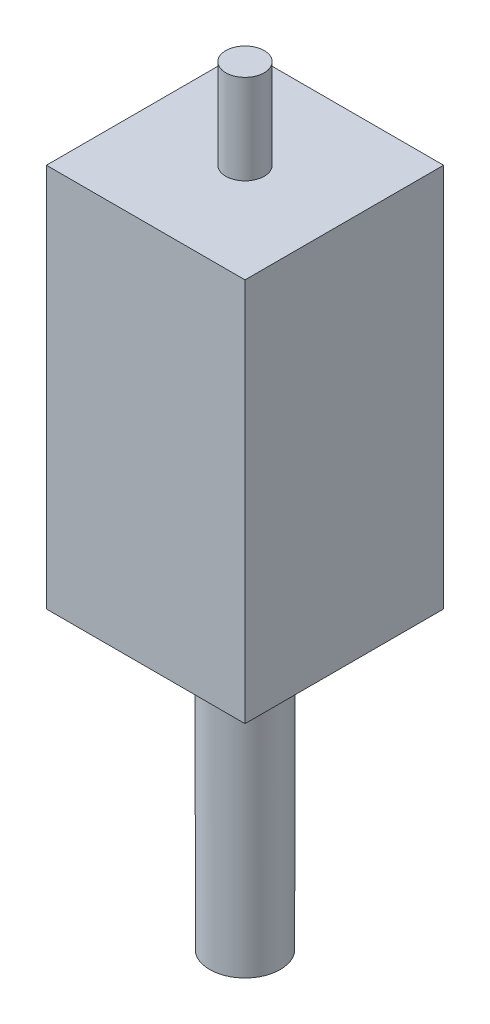
ISO-10303-21;
HEADER;
FILE_DESCRIPTION(('STEP AP214'),'2;1');
FILE_NAME('part.step','',(''),(''),'','','');
FILE_SCHEMA(('AUTOMOTIVE_DESIGN { 1 0 10303 214 1 1 1 1 }'));
ENDSEC;
DATA;
#1=APPLICATION_CONTEXT('core data for automotive mechanical design processes');
#2=APPLICATION_PROTOCOL_DEFINITION('international standard','automotive_design',2000,#1);
#3=PRODUCT_CONTEXT('',#1,'mechanical');
#4=PRODUCT('Part','Part','',(#3));
#5=PRODUCT_RELATED_PRODUCT_CATEGORY('part','',(#4));
#6=PRODUCT_DEFINITION_FORMATION('','',#4);
#7=PRODUCT_DEFINITION_CONTEXT('part definition',#1,'design');
#8=PRODUCT_DEFINITION('design','',#6,#7);
#9=PRODUCT_DEFINITION_SHAPE('','',#8);
#10=(LENGTH_UNIT() NAMED_UNIT(*) SI_UNIT(.MILLI.,.METRE.));
#11=(NAMED_UNIT(*) PLANE_ANGLE_UNIT() SI_UNIT($,.RADIAN.));
#12=(NAMED_UNIT(*) SI_UNIT($,.STERADIAN.) SOLID_ANGLE_UNIT());
#13=UNCERTAINTY_MEASURE_WITH_UNIT(LENGTH_MEASURE(1.E-05),#10,'distance_accuracy_value','');
#14=(GEOMETRIC_REPRESENTATION_CONTEXT(3) GLOBAL_UNCERTAINTY_ASSIGNED_CONTEXT((#13)) GLOBAL_UNIT_ASSIGNED_CONTEXT((#10,
#11,#12)) REPRESENTATION_CONTEXT('',''));
#15=CARTESIAN_POINT('',(0.,0.,0.));
#16=DIRECTION('',(0.,0.,1.));
#17=DIRECTION('',(1.,0.,0.));
#18=AXIS2_PLACEMENT_3D('',#15,#16,#17);
#19=CARTESIAN_POINT('',(-0.879709692178446,15.8049516041819,15.5));
#20=DIRECTION('',(1.,0.,0.));
#21=DIRECTION('',(0.,1.,0.));
#22=AXIS2_PLACEMENT_3D('',#19,#20,#21);
#23=PLANE('',#22);
#24=CARTESIAN_POINT('',(-0.879709692178446,8.30495160418194,7.75));
#25=DIRECTION('',(-1.,0.,0.));
#26=DIRECTION('',(0.,0.,1.));
#27=AXIS2_PLACEMENT_3D('',#24,#25,#26);
#28=CIRCLE('',#27,1.24999999999999);
#29=CARTESIAN_POINT('',(-0.879709692178446,8.30495160418194,8.99999999999999));
#30=VERTEX_POINT('',#29);
#31=EDGE_CURVE('E99',#30,#30,#28,.T.);
#32=ORIENTED_EDGE('',*,*,#31,.F.);
#33=EDGE_LOOP('',(#32));
#34=FACE_BOUND('',#33,.T.);
#35=CARTESIAN_POINT('',(-0.879709692178445,-6.69504839581806,7.75));
#36=DIRECTION('',(-1.,0.,0.));
#37=DIRECTION('',(0.,0.,1.));
#38=AXIS2_PLACEMENT_3D('',#35,#36,#37);
#39=CIRCLE('',#38,1.24999999999999);
#40=CARTESIAN_POINT('',(-0.879709692178445,-6.69504839581806,8.99999999999999));
#41=VERTEX_POINT('',#40);
#42=EDGE_CURVE('E98',#41,#41,#39,.T.);
#43=ORIENTED_EDGE('',*,*,#42,.F.);
#44=EDGE_LOOP('',(#43));
#45=FACE_BOUND('',#44,.T.);
#46=DIRECTION('',(0.,-1.,0.));
#47=VECTOR('',#46,1.);
#48=CARTESIAN_POINT('',(-0.879709692178446,15.8049516041819,0.));
#49=LINE('',#48,#47);
#50=CARTESIAN_POINT('',(-0.879709692178446,15.8049516041819,0.));
#51=VERTEX_POINT('',#50);
#52=CARTESIAN_POINT('',(-0.879709692178442,-14.1950483958181,0.));
#53=VERTEX_POINT('',#52);
#54=EDGE_CURVE('E115',#51,#53,#49,.T.);
#55=ORIENTED_EDGE('',*,*,#54,.T.);
#56=DIRECTION('',(0.,0.,-1.));
#57=VECTOR('',#56,1.);
#58=CARTESIAN_POINT('',(-0.879709692178442,-14.1950483958181,15.5));
#59=LINE('',#58,#57);
#60=CARTESIAN_POINT('',(-0.879709692178442,-14.1950483958181,15.5));
#61=VERTEX_POINT('',#60);
#62=EDGE_CURVE('E134',#61,#53,#59,.T.);
#63=ORIENTED_EDGE('',*,*,#62,.F.);
#64=DIRECTION('',(0.,-1.,0.));
#65=VECTOR('',#64,1.);
#66=CARTESIAN_POINT('',(-0.879709692178446,15.8049516041819,15.5));
#67=LINE('',#66,#65);
#68=CARTESIAN_POINT('',(-0.879709692178446,15.8049516041819,15.5));
#69=VERTEX_POINT('',#68);
#70=EDGE_CURVE('E116',#69,#61,#67,.T.);
#71=ORIENTED_EDGE('',*,*,#70,.F.);
#72=DIRECTION('',(0.,0.,-1.));
#73=VECTOR('',#72,1.);
#74=CARTESIAN_POINT('',(-0.879709692178446,15.8049516041819,15.5));
#75=LINE('',#74,#73);
#76=EDGE_CURVE('E122',#69,#51,#75,.T.);
#77=ORIENTED_EDGE('',*,*,#76,.T.);
#78=EDGE_LOOP('',(#55,#63,#71,#77));
#79=FACE_BOUND('',#78,.T.);
#80=ADVANCED_FACE('F33',(#34,#45,#79),#23,.F.);
#81=CARTESIAN_POINT('',(-0.879709692178442,-14.1950483958181,15.5));
#82=DIRECTION('',(0.,1.,0.));
#83=DIRECTION('',(-1.,0.,0.));
#84=AXIS2_PLACEMENT_3D('',#81,#82,#83);
#85=PLANE('',#84);
#86=CARTESIAN_POINT('',(6.87029030782155,-14.1950483958181,7.75));
#87=DIRECTION('',(0.,1.,0.));
#88=DIRECTION('',(-1.,0.,0.));
#89=AXIS2_PLACEMENT_3D('',#86,#87,#88);
#90=CIRCLE('',#89,2.75);
#91=CARTESIAN_POINT('',(4.12029030782155,-14.1950483958181,7.75));
#92=VERTEX_POINT('',#91);
#93=EDGE_CURVE('E11',#92,#92,#90,.F.);
#94=ORIENTED_EDGE('',*,*,#93,.F.);
#95=EDGE_LOOP('',(#94));
#96=FACE_BOUND('',#95,.T.);
#97=DIRECTION('',(1.,0.,0.));
#98=VECTOR('',#97,1.);
#99=CARTESIAN_POINT('',(-0.879709692178442,-14.1950483958181,0.));
#100=LINE('',#99,#98);
#101=CARTESIAN_POINT('',(14.6202903078216,-14.1950483958181,0.));
#102=VERTEX_POINT('',#101);
#103=EDGE_CURVE('E125',#53,#102,#100,.T.);
#104=ORIENTED_EDGE('',*,*,#103,.T.);
#105=DIRECTION('',(0.,0.,-1.));
#106=VECTOR('',#105,1.);
#107=CARTESIAN_POINT('',(14.6202903078216,-14.1950483958181,15.5));
#108=LINE('',#107,#106);
#109=CARTESIAN_POINT('',(14.6202903078216,-14.1950483958181,15.5));
#110=VERTEX_POINT('',#109);
#111=EDGE_CURVE('E132',#110,#102,#108,.T.);
#112=ORIENTED_EDGE('',*,*,#111,.F.);
#113=DIRECTION('',(1.,0.,0.));
#114=VECTOR('',#113,1.);
#115=CARTESIAN_POINT('',(-0.879709692178442,-14.1950483958181,15.5));
#116=LINE('',#115,#114);
#117=EDGE_CURVE('E81',#61,#110,#116,.T.);
#118=ORIENTED_EDGE('',*,*,#117,.F.);
#119=ORIENTED_EDGE('',*,*,#62,.T.);
#120=EDGE_LOOP('',(#104,#112,#118,#119));
#121=FACE_BOUND('',#120,.T.);
#122=ADVANCED_FACE('F151',(#96,#121),#85,.F.);
#123=CARTESIAN_POINT('',(14.6202903078216,15.8049516041819,15.5));
#124=DIRECTION('',(-1.,0.,0.));
#125=DIRECTION('',(0.,0.,1.));
#126=AXIS2_PLACEMENT_3D('',#123,#124,#125);
#127=PLANE('',#126);
#128=DIRECTION('',(0.,1.,0.));
#129=VECTOR('',#128,1.);
#130=CARTESIAN_POINT('',(14.6202903078216,15.8049516041819,0.));
#131=LINE('',#130,#129);
#132=CARTESIAN_POINT('',(14.6202903078216,15.8049516041819,0.));
#133=VERTEX_POINT('',#132);
#134=EDGE_CURVE('E67',#102,#133,#131,.T.);
#135=ORIENTED_EDGE('',*,*,#134,.T.);
#136=DIRECTION('',(0.,0.,-1.));
#137=VECTOR('',#136,1.);
#138=CARTESIAN_POINT('',(14.6202903078216,15.8049516041819,15.5));
#139=LINE('',#138,#137);
#140=CARTESIAN_POINT('',(14.6202903078216,15.8049516041819,15.5));
#141=VERTEX_POINT('',#140);
#142=EDGE_CURVE('E130',#141,#133,#139,.T.);
#143=ORIENTED_EDGE('',*,*,#142,.F.);
#144=DIRECTION('',(0.,1.,0.));
#145=VECTOR('',#144,1.);
#146=CARTESIAN_POINT('',(14.6202903078216,15.8049516041819,15.5));
#147=LINE('',#146,#145);
#148=EDGE_CURVE('E119',#110,#141,#147,.T.);
#149=ORIENTED_EDGE('',*,*,#148,.F.);
#150=ORIENTED_EDGE('',*,*,#111,.T.);
#151=EDGE_LOOP('',(#135,#143,#149,#150));
#152=FACE_BOUND('',#151,.T.);
#153=ADVANCED_FACE('F143',(#152),#127,.F.);
#154=CARTESIAN_POINT('',(-0.879709692178446,15.8049516041819,15.5));
#155=DIRECTION('',(0.,-1.,0.));
#156=DIRECTION('',(0.,0.,-1.));
#157=AXIS2_PLACEMENT_3D('',#154,#155,#156);
#158=PLANE('',#157);
#159=CARTESIAN_POINT('',(6.87029030782155,15.8049516041819,7.75));
#160=DIRECTION('',(0.,-1.,0.));
#161=DIRECTION('',(0.,0.,-1.));
#162=AXIS2_PLACEMENT_3D('',#159,#160,#161);
#163=CIRCLE('',#162,1.5);
#164=CARTESIAN_POINT('',(6.87029030782155,15.8049516041819,6.25));
#165=VERTEX_POINT('',#164);
#166=EDGE_CURVE('E41',#165,#165,#163,.F.);
#167=ORIENTED_EDGE('',*,*,#166,.F.);
#168=EDGE_LOOP('',(#167));
#169=FACE_BOUND('',#168,.T.);
#170=DIRECTION('',(-1.,0.,0.));
#171=VECTOR('',#170,1.);
#172=CARTESIAN_POINT('',(-0.879709692178446,15.8049516041819,0.));
#173=LINE('',#172,#171);
#174=EDGE_CURVE('E73',#133,#51,#173,.T.);
#175=ORIENTED_EDGE('',*,*,#174,.T.);
#176=ORIENTED_EDGE('',*,*,#76,.F.);
#177=DIRECTION('',(-1.,0.,0.));
#178=VECTOR('',#177,1.);
#179=CARTESIAN_POINT('',(-0.879709692178446,15.8049516041819,15.5));
#180=LINE('',#179,#178);
#181=EDGE_CURVE('E49',#141,#69,#180,.T.);
#182=ORIENTED_EDGE('',*,*,#181,.F.);
#183=ORIENTED_EDGE('',*,*,#142,.T.);
#184=EDGE_LOOP('',(#175,#176,#182,#183));
#185=FACE_BOUND('',#184,.T.);
#186=ADVANCED_FACE('F140',(#169,#185),#158,.F.);
#187=CARTESIAN_POINT('',(0.,0.,15.5));
#188=DIRECTION('',(0.,0.,1.));
#189=DIRECTION('',(1.,0.,0.));
#190=AXIS2_PLACEMENT_3D('',#187,#188,#189);
#191=PLANE('',#190);
#192=ORIENTED_EDGE('',*,*,#70,.T.);
#193=ORIENTED_EDGE('',*,*,#117,.T.);
#194=ORIENTED_EDGE('',*,*,#148,.T.);
#195=ORIENTED_EDGE('',*,*,#181,.T.);
#196=EDGE_LOOP('',(#192,#193,#194,#195));
#197=FACE_BOUND('',#196,.T.);
#198=ADVANCED_FACE('F142',(#197),#191,.T.);
#199=CARTESIAN_POINT('',(0.,0.,0.));
#200=DIRECTION('',(0.,0.,1.));
#201=DIRECTION('',(1.,0.,0.));
#202=AXIS2_PLACEMENT_3D('',#199,#200,#201);
#203=PLANE('',#202);
#204=ORIENTED_EDGE('',*,*,#54,.F.);
#205=ORIENTED_EDGE('',*,*,#174,.F.);
#206=ORIENTED_EDGE('',*,*,#134,.F.);
#207=ORIENTED_EDGE('',*,*,#103,.F.);
#208=EDGE_LOOP('',(#204,#205,#206,#207));
#209=FACE_BOUND('',#208,.T.);
#210=ADVANCED_FACE('F149',(#209),#203,.F.);
#211=CARTESIAN_POINT('',(6.87029030782155,22.8049516041819,7.75));
#212=DIRECTION('',(0.,-1.,0.));
#213=DIRECTION('',(0.,0.,-1.));
#214=AXIS2_PLACEMENT_3D('',#211,#212,#213);
#215=CYLINDRICAL_SURFACE('',#214,1.5);
#216=CARTESIAN_POINT('',(6.87029030782155,22.8049516041819,7.75));
#217=DIRECTION('',(0.,1.,0.));
#218=DIRECTION('',(0.,0.,1.));
#219=AXIS2_PLACEMENT_3D('',#216,#217,#218);
#220=CIRCLE('',#219,1.5);
#221=CARTESIAN_POINT('',(6.87029030782155,22.8049516041819,9.25));
#222=VERTEX_POINT('',#221);
#223=EDGE_CURVE('E112',#222,#222,#220,.T.);
#224=ORIENTED_EDGE('',*,*,#223,.F.);
#225=EDGE_LOOP('',(#224));
#226=FACE_BOUND('',#225,.T.);
#227=ORIENTED_EDGE('',*,*,#166,.T.);
#228=EDGE_LOOP('',(#227));
#229=FACE_BOUND('',#228,.T.);
#230=ADVANCED_FACE('F138',(#226,#229),#215,.T.);
#231=CARTESIAN_POINT('',(6.87029030782155,22.8049516041819,7.75));
#232=DIRECTION('',(0.,1.,0.));
#233=DIRECTION('',(0.,0.,1.));
#234=AXIS2_PLACEMENT_3D('',#231,#232,#233);
#235=PLANE('',#234);
#236=ORIENTED_EDGE('',*,*,#223,.T.);
#237=EDGE_LOOP('',(#236));
#238=FACE_BOUND('',#237,.T.);
#239=ADVANCED_FACE('F173',(#238),#235,.T.);
#240=CARTESIAN_POINT('',(6.87029030782156,-37.1950483958181,7.75));
#241=DIRECTION('',(0.,1.,0.));
#242=DIRECTION('',(-1.,0.,0.));
#243=AXIS2_PLACEMENT_3D('',#240,#241,#242);
#244=CYLINDRICAL_SURFACE('',#243,2.75);
#245=CARTESIAN_POINT('',(6.87029030782156,-37.1950483958181,7.75));
#246=DIRECTION('',(0.,-1.,0.));
#247=DIRECTION('',(1.,0.,0.));
#248=AXIS2_PLACEMENT_3D('',#245,#246,#247);
#249=CIRCLE('',#248,2.75);
#250=CARTESIAN_POINT('',(9.62029030782156,-37.1950483958181,7.75));
#251=VERTEX_POINT('',#250);
#252=EDGE_CURVE('E109',#251,#251,#249,.T.);
#253=ORIENTED_EDGE('',*,*,#252,.F.);
#254=EDGE_LOOP('',(#253));
#255=FACE_BOUND('',#254,.T.);
#256=ORIENTED_EDGE('',*,*,#93,.T.);
#257=EDGE_LOOP('',(#256));
#258=FACE_BOUND('',#257,.T.);
#259=ADVANCED_FACE('F179',(#255,#258),#244,.T.);
#260=CARTESIAN_POINT('',(6.87029030782156,-37.1950483958181,7.75));
#261=DIRECTION('',(0.,-1.,0.));
#262=DIRECTION('',(1.,0.,0.));
#263=AXIS2_PLACEMENT_3D('',#260,#261,#262);
#264=PLANE('',#263);
#265=ORIENTED_EDGE('',*,*,#252,.T.);
#266=EDGE_LOOP('',(#265));
#267=FACE_BOUND('',#266,.T.);
#268=ADVANCED_FACE('F183',(#267),#264,.T.);
#269=CARTESIAN_POINT('',(0.220290307821557,-6.69504839581806,7.75));
#270=DIRECTION('',(-1.,0.,0.));
#271=DIRECTION('',(0.,0.,1.));
#272=AXIS2_PLACEMENT_3D('',#269,#270,#271);
#273=CONICAL_SURFACE('',#272,1.25,1.02974425867665);
#274=CARTESIAN_POINT('',(0.971366081606008,-6.69504839581806,7.75));
#275=VERTEX_POINT('',#274);
#276=VERTEX_LOOP('',#275);
#277=FACE_BOUND('',#276,.T.);
#278=CARTESIAN_POINT('',(0.220290307821557,-6.69504839581806,7.75));
#279=DIRECTION('',(-1.,0.,0.));
#280=DIRECTION('',(0.,0.,1.));
#281=AXIS2_PLACEMENT_3D('',#278,#279,#280);
#282=CIRCLE('',#281,1.25);
#283=CARTESIAN_POINT('',(0.220290307821557,-6.69504839581806,9.));
#284=VERTEX_POINT('',#283);
#285=EDGE_CURVE('E102',#284,#284,#282,.T.);
#286=ORIENTED_EDGE('',*,*,#285,.T.);
#287=EDGE_LOOP('',(#286));
#288=FACE_BOUND('',#287,.T.);
#289=ADVANCED_FACE('F187',(#277,#288),#273,.F.);
#290=CARTESIAN_POINT('',(-0.879709692178443,-6.69504839581806,7.75));
#291=DIRECTION('',(-1.,0.,0.));
#292=DIRECTION('',(0.,0.,1.));
#293=AXIS2_PLACEMENT_3D('',#290,#291,#292);
#294=CYLINDRICAL_SURFACE('',#293,1.24999999999999);
#295=ORIENTED_EDGE('',*,*,#285,.F.);
#296=EDGE_LOOP('',(#295));
#297=FACE_BOUND('',#296,.T.);
#298=ORIENTED_EDGE('',*,*,#42,.T.);
#299=EDGE_LOOP('',(#298));
#300=FACE_BOUND('',#299,.T.);
#301=ADVANCED_FACE('F92',(#297,#300),#294,.F.);
#302=CARTESIAN_POINT('',(0.220290307821555,8.30495160418194,7.75));
#303=DIRECTION('',(-1.,0.,0.));
#304=DIRECTION('',(0.,0.,1.));
#305=AXIS2_PLACEMENT_3D('',#302,#303,#304);
#306=CONICAL_SURFACE('',#305,1.25,1.02974425867665);
#307=CARTESIAN_POINT('',(0.971366081606006,8.30495160418194,7.75));
#308=VERTEX_POINT('',#307);
#309=VERTEX_LOOP('',#308);
#310=FACE_BOUND('',#309,.T.);
#311=CARTESIAN_POINT('',(0.220290307821555,8.30495160418194,7.75));
#312=DIRECTION('',(-1.,0.,0.));
#313=DIRECTION('',(0.,0.,1.));
#314=AXIS2_PLACEMENT_3D('',#311,#312,#313);
#315=CIRCLE('',#314,1.25);
#316=CARTESIAN_POINT('',(0.220290307821555,8.30495160418194,9.));
#317=VERTEX_POINT('',#316);
#318=EDGE_CURVE('E96',#317,#317,#315,.T.);
#319=ORIENTED_EDGE('',*,*,#318,.T.);
#320=EDGE_LOOP('',(#319));
#321=FACE_BOUND('',#320,.T.);
#322=ADVANCED_FACE('F88',(#310,#321),#306,.F.);
#323=CARTESIAN_POINT('',(-0.879709692178445,8.30495160418194,7.75));
#324=DIRECTION('',(-1.,0.,0.));
#325=DIRECTION('',(0.,0.,1.));
#326=AXIS2_PLACEMENT_3D('',#323,#324,#325);
#327=CYLINDRICAL_SURFACE('',#326,1.24999999999999);
#328=ORIENTED_EDGE('',*,*,#318,.F.);
#329=EDGE_LOOP('',(#328));
#330=FACE_BOUND('',#329,.T.);
#331=ORIENTED_EDGE('',*,*,#31,.T.);
#332=EDGE_LOOP('',(#331));
#333=FACE_BOUND('',#332,.T.);
#334=ADVANCED_FACE('F91',(#330,#333),#327,.F.);
#335=CLOSED_SHELL('',(#80,#122,#153,#186,#198,#210,#230,#239,#259,#268,#289,#301,#322,#334));
#336=MANIFOLD_SOLID_BREP('B2',#335);
#337=ADVANCED_BREP_SHAPE_REPRESENTATION('',(#18,#336),#14);
#338=SHAPE_DEFINITION_REPRESENTATION(#9,#337);
ENDSEC;
END-ISO-10303-21;
